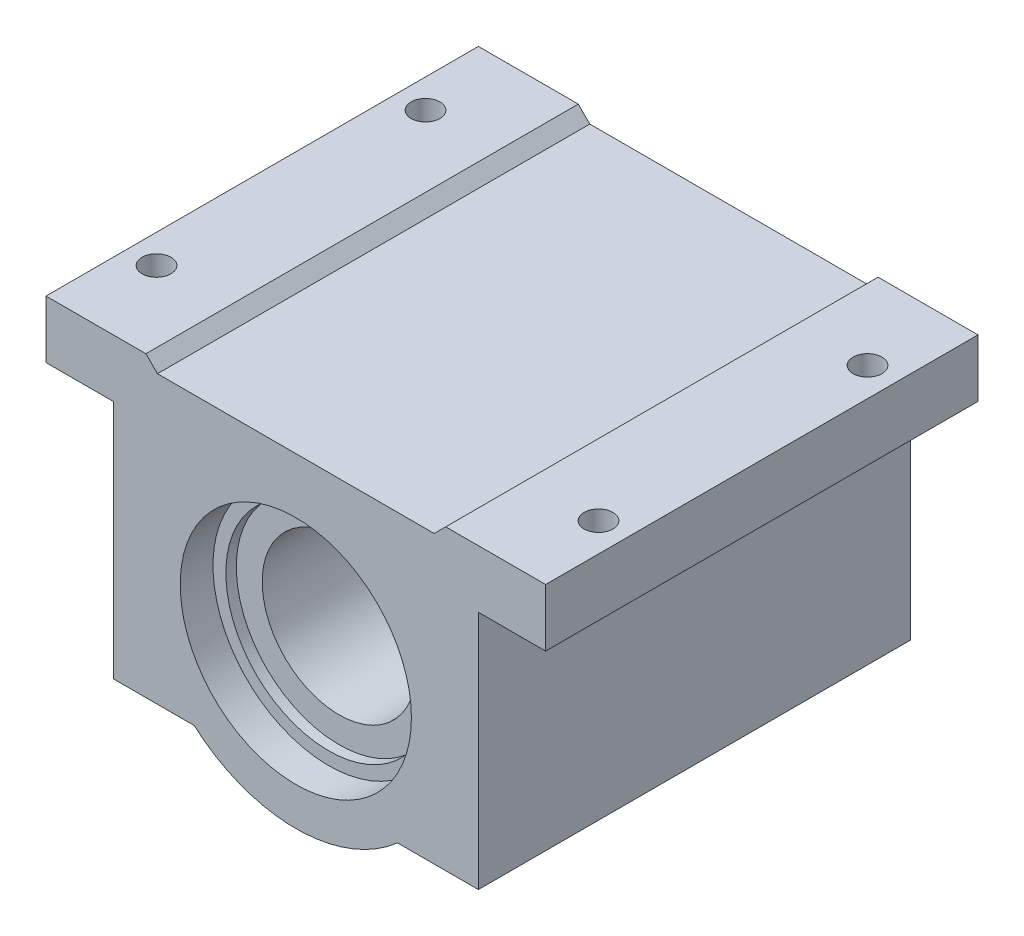
ISO-10303-21;
HEADER;
FILE_DESCRIPTION(('STEP AP214'),'2;1');
FILE_NAME('part.step','',(''),(''),'','','');
FILE_SCHEMA(('AUTOMOTIVE_DESIGN { 1 0 10303 214 1 1 1 1 }'));
ENDSEC;
DATA;
#1=APPLICATION_CONTEXT('core data for automotive mechanical design processes');
#2=APPLICATION_PROTOCOL_DEFINITION('international standard','automotive_design',2000,#1);
#3=PRODUCT_CONTEXT('',#1,'mechanical');
#4=PRODUCT('Part','Part','',(#3));
#5=PRODUCT_RELATED_PRODUCT_CATEGORY('part','',(#4));
#6=PRODUCT_DEFINITION_FORMATION('','',#4);
#7=PRODUCT_DEFINITION_CONTEXT('part definition',#1,'design');
#8=PRODUCT_DEFINITION('design','',#6,#7);
#9=PRODUCT_DEFINITION_SHAPE('','',#8);
#10=(LENGTH_UNIT() NAMED_UNIT(*) SI_UNIT(.MILLI.,.METRE.));
#11=(NAMED_UNIT(*) PLANE_ANGLE_UNIT() SI_UNIT($,.RADIAN.));
#12=(NAMED_UNIT(*) SI_UNIT($,.STERADIAN.) SOLID_ANGLE_UNIT());
#13=UNCERTAINTY_MEASURE_WITH_UNIT(LENGTH_MEASURE(1.E-05),#10,'distance_accuracy_value','');
#14=(GEOMETRIC_REPRESENTATION_CONTEXT(3) GLOBAL_UNCERTAINTY_ASSIGNED_CONTEXT((#13)) GLOBAL_UNIT_ASSIGNED_CONTEXT((#10,
#11,#12)) REPRESENTATION_CONTEXT('',''));
#15=CARTESIAN_POINT('',(0.,0.,0.));
#16=DIRECTION('',(0.,0.,1.));
#17=DIRECTION('',(1.,0.,0.));
#18=AXIS2_PLACEMENT_3D('',#15,#16,#17);
#19=CARTESIAN_POINT('',(0.,0.,28.575));
#20=DIRECTION('',(0.,0.,1.));
#21=DIRECTION('',(1.,0.,0.));
#22=AXIS2_PLACEMENT_3D('',#19,#20,#21);
#23=CYLINDRICAL_SURFACE('',#22,21.2217);
#24=CARTESIAN_POINT('',(0.,0.,28.575));
#25=DIRECTION('',(0.,0.,1.));
#26=DIRECTION('',(1.,0.,0.));
#27=AXIS2_PLACEMENT_3D('',#24,#25,#26);
#28=CIRCLE('',#27,21.2217);
#29=CARTESIAN_POINT('',(21.2217,0.,28.575));
#30=VERTEX_POINT('',#29);
#31=EDGE_CURVE('E11',#30,#30,#28,.T.);
#32=ORIENTED_EDGE('',*,*,#31,.T.);
#33=EDGE_LOOP('',(#32));
#34=FACE_BOUND('',#33,.T.);
#35=CARTESIAN_POINT('',(0.,0.,30.3022));
#36=DIRECTION('',(0.,0.,1.));
#37=DIRECTION('',(1.,0.,0.));
#38=AXIS2_PLACEMENT_3D('',#35,#36,#37);
#39=CIRCLE('',#38,21.2217);
#40=CARTESIAN_POINT('',(21.2217,0.,30.3022));
#41=VERTEX_POINT('',#40);
#42=EDGE_CURVE('E55',#41,#41,#39,.T.);
#43=ORIENTED_EDGE('',*,*,#42,.F.);
#44=EDGE_LOOP('',(#43));
#45=FACE_BOUND('',#44,.T.);
#46=ADVANCED_FACE('F41',(#34,#45),#23,.T.);
#47=CARTESIAN_POINT('',(-1.18552271245644E-13,16.97736,28.575));
#48=DIRECTION('',(0.,0.,-1.));
#49=DIRECTION('',(-1.,0.,0.));
#50=AXIS2_PLACEMENT_3D('',#47,#48,#49);
#51=PLANE('',#50);
#52=CARTESIAN_POINT('',(0.,0.,28.575));
#53=DIRECTION('',(0.,0.,1.));
#54=DIRECTION('',(1.,0.,0.));
#55=AXIS2_PLACEMENT_3D('',#52,#53,#54);
#56=CIRCLE('',#55,16.97736);
#57=CARTESIAN_POINT('',(16.97736,0.,28.575));
#58=VERTEX_POINT('',#57);
#59=EDGE_CURVE('E47',#58,#58,#56,.T.);
#60=ORIENTED_EDGE('',*,*,#59,.T.);
#61=EDGE_LOOP('',(#60));
#62=FACE_BOUND('',#61,.T.);
#63=ORIENTED_EDGE('',*,*,#31,.F.);
#64=EDGE_LOOP('',(#63));
#65=FACE_BOUND('',#64,.T.);
#66=ADVANCED_FACE('F65',(#62,#65),#51,.T.);
#67=CARTESIAN_POINT('',(0.,0.,28.575));
#68=DIRECTION('',(0.,0.,1.));
#69=DIRECTION('',(1.,0.,0.));
#70=AXIS2_PLACEMENT_3D('',#67,#68,#69);
#71=CYLINDRICAL_SURFACE('',#70,16.97736);
#72=CARTESIAN_POINT('',(0.,0.,30.3022));
#73=DIRECTION('',(0.,0.,1.));
#74=DIRECTION('',(1.,0.,0.));
#75=AXIS2_PLACEMENT_3D('',#72,#73,#74);
#76=CIRCLE('',#75,16.97736);
#77=CARTESIAN_POINT('',(16.97736,0.,30.3022));
#78=VERTEX_POINT('',#77);
#79=EDGE_CURVE('E51',#78,#78,#76,.T.);
#80=ORIENTED_EDGE('',*,*,#79,.T.);
#81=EDGE_LOOP('',(#80));
#82=FACE_BOUND('',#81,.T.);
#83=ORIENTED_EDGE('',*,*,#59,.F.);
#84=EDGE_LOOP('',(#83));
#85=FACE_BOUND('',#84,.T.);
#86=ADVANCED_FACE('F69',(#82,#85),#71,.F.);
#87=CARTESIAN_POINT('',(-1.18552271245644E-13,16.97736,30.3022));
#88=DIRECTION('',(0.,0.,1.));
#89=DIRECTION('',(1.,0.,0.));
#90=AXIS2_PLACEMENT_3D('',#87,#88,#89);
#91=PLANE('',#90);
#92=ORIENTED_EDGE('',*,*,#42,.T.);
#93=EDGE_LOOP('',(#92));
#94=FACE_BOUND('',#93,.T.);
#95=ORIENTED_EDGE('',*,*,#79,.F.);
#96=EDGE_LOOP('',(#95));
#97=FACE_BOUND('',#96,.T.);
#98=ADVANCED_FACE('F61',(#94,#97),#91,.T.);
#99=CLOSED_SHELL('',(#46,#66,#86,#98));
#100=MANIFOLD_SOLID_BREP('B2',#99);
#101=CARTESIAN_POINT('',(0.,0.,28.575));
#102=DIRECTION('',(0.,0.,1.));
#103=DIRECTION('',(1.,0.,0.));
#104=AXIS2_PLACEMENT_3D('',#101,#102,#103);
#105=CYLINDRICAL_SURFACE('',#104,21.2217);
#106=CARTESIAN_POINT('',(0.,0.,-30.3022));
#107=DIRECTION('',(0.,0.,1.));
#108=DIRECTION('',(1.,0.,0.));
#109=AXIS2_PLACEMENT_3D('',#106,#107,#108);
#110=CIRCLE('',#109,21.2217);
#111=CARTESIAN_POINT('',(21.2217,0.,-30.3022));
#112=VERTEX_POINT('',#111);
#113=EDGE_CURVE('E124',#112,#112,#110,.T.);
#114=ORIENTED_EDGE('',*,*,#113,.T.);
#115=EDGE_LOOP('',(#114));
#116=FACE_BOUND('',#115,.T.);
#117=CARTESIAN_POINT('',(0.,0.,-28.575));
#118=DIRECTION('',(0.,0.,1.));
#119=DIRECTION('',(1.,0.,0.));
#120=AXIS2_PLACEMENT_3D('',#117,#118,#119);
#121=CIRCLE('',#120,21.2217);
#122=CARTESIAN_POINT('',(21.2217,0.,-28.575));
#123=VERTEX_POINT('',#122);
#124=EDGE_CURVE('E40',#123,#123,#121,.T.);
#125=ORIENTED_EDGE('',*,*,#124,.F.);
#126=EDGE_LOOP('',(#125));
#127=FACE_BOUND('',#126,.T.);
#128=ADVANCED_FACE('F110',(#116,#127),#105,.T.);
#129=CARTESIAN_POINT('',(-1.18552271245644E-13,16.97736,-28.575));
#130=DIRECTION('',(0.,0.,1.));
#131=DIRECTION('',(1.,0.,0.));
#132=AXIS2_PLACEMENT_3D('',#129,#130,#131);
#133=PLANE('',#132);
#134=ORIENTED_EDGE('',*,*,#124,.T.);
#135=EDGE_LOOP('',(#134));
#136=FACE_BOUND('',#135,.T.);
#137=CARTESIAN_POINT('',(0.,0.,-28.575));
#138=DIRECTION('',(0.,0.,1.));
#139=DIRECTION('',(1.,0.,0.));
#140=AXIS2_PLACEMENT_3D('',#137,#138,#139);
#141=CIRCLE('',#140,16.97736);
#142=CARTESIAN_POINT('',(16.97736,0.,-28.575));
#143=VERTEX_POINT('',#142);
#144=EDGE_CURVE('E116',#143,#143,#141,.T.);
#145=ORIENTED_EDGE('',*,*,#144,.F.);
#146=EDGE_LOOP('',(#145));
#147=FACE_BOUND('',#146,.T.);
#148=ADVANCED_FACE('F140',(#136,#147),#133,.T.);
#149=CARTESIAN_POINT('',(0.,0.,28.575));
#150=DIRECTION('',(0.,0.,1.));
#151=DIRECTION('',(1.,0.,0.));
#152=AXIS2_PLACEMENT_3D('',#149,#150,#151);
#153=CYLINDRICAL_SURFACE('',#152,16.97736);
#154=ORIENTED_EDGE('',*,*,#144,.T.);
#155=EDGE_LOOP('',(#154));
#156=FACE_BOUND('',#155,.T.);
#157=CARTESIAN_POINT('',(0.,0.,-30.3022));
#158=DIRECTION('',(0.,0.,1.));
#159=DIRECTION('',(1.,0.,0.));
#160=AXIS2_PLACEMENT_3D('',#157,#158,#159);
#161=CIRCLE('',#160,16.97736);
#162=CARTESIAN_POINT('',(16.97736,0.,-30.3022));
#163=VERTEX_POINT('',#162);
#164=EDGE_CURVE('E120',#163,#163,#161,.T.);
#165=ORIENTED_EDGE('',*,*,#164,.F.);
#166=EDGE_LOOP('',(#165));
#167=FACE_BOUND('',#166,.T.);
#168=ADVANCED_FACE('F134',(#156,#167),#153,.F.);
#169=CARTESIAN_POINT('',(-1.18552271245644E-13,16.97736,-30.3022));
#170=DIRECTION('',(0.,0.,-1.));
#171=DIRECTION('',(-1.,0.,0.));
#172=AXIS2_PLACEMENT_3D('',#169,#170,#171);
#173=PLANE('',#172);
#174=ORIENTED_EDGE('',*,*,#164,.T.);
#175=EDGE_LOOP('',(#174));
#176=FACE_BOUND('',#175,.T.);
#177=ORIENTED_EDGE('',*,*,#113,.F.);
#178=EDGE_LOOP('',(#177));
#179=FACE_BOUND('',#178,.T.);
#180=ADVANCED_FACE('F132',(#176,#179),#173,.T.);
#181=CLOSED_SHELL('',(#128,#148,#168,#180));
#182=MANIFOLD_SOLID_BREP('B6',#181);
#183=CARTESIAN_POINT('',(0.,0.,28.575));
#184=DIRECTION('',(0.,0.,1.));
#185=DIRECTION('',(1.,0.,0.));
#186=AXIS2_PLACEMENT_3D('',#183,#184,#185);
#187=PLANE('',#186);
#188=CARTESIAN_POINT('',(0.,0.,28.575));
#189=DIRECTION('',(0.,0.,1.));
#190=DIRECTION('',(1.,0.,0.));
#191=AXIS2_PLACEMENT_3D('',#188,#189,#190);
#192=CIRCLE('',#191,19.09953);
#193=CARTESIAN_POINT('',(19.09953,0.,28.575));
#194=VERTEX_POINT('',#193);
#195=EDGE_CURVE('E109',#194,#194,#192,.T.);
#196=ORIENTED_EDGE('',*,*,#195,.T.);
#197=EDGE_LOOP('',(#196));
#198=FACE_BOUND('',#197,.T.);
#199=CARTESIAN_POINT('',(0.,0.,28.575));
#200=DIRECTION('',(0.,0.,1.));
#201=DIRECTION('',(1.,0.,0.));
#202=AXIS2_PLACEMENT_3D('',#199,#200,#201);
#203=CIRCLE('',#202,12.7);
#204=CARTESIAN_POINT('',(12.7,0.,28.575));
#205=VERTEX_POINT('',#204);
#206=EDGE_CURVE('E191',#205,#205,#203,.T.);
#207=ORIENTED_EDGE('',*,*,#206,.F.);
#208=EDGE_LOOP('',(#207));
#209=FACE_BOUND('',#208,.T.);
#210=ADVANCED_FACE('F180',(#198,#209),#187,.T.);
#211=CARTESIAN_POINT('',(0.,0.,-28.575));
#212=DIRECTION('',(0.,0.,1.));
#213=DIRECTION('',(1.,0.,0.));
#214=AXIS2_PLACEMENT_3D('',#211,#212,#213);
#215=PLANE('',#214);
#216=CARTESIAN_POINT('',(0.,0.,-28.575));
#217=DIRECTION('',(0.,0.,1.));
#218=DIRECTION('',(1.,0.,0.));
#219=AXIS2_PLACEMENT_3D('',#216,#217,#218);
#220=CIRCLE('',#219,19.09953);
#221=CARTESIAN_POINT('',(19.09953,0.,-28.575));
#222=VERTEX_POINT('',#221);
#223=EDGE_CURVE('E184',#222,#222,#220,.T.);
#224=ORIENTED_EDGE('',*,*,#223,.F.);
#225=EDGE_LOOP('',(#224));
#226=FACE_BOUND('',#225,.T.);
#227=CARTESIAN_POINT('',(0.,0.,-28.575));
#228=DIRECTION('',(0.,0.,1.));
#229=DIRECTION('',(1.,0.,0.));
#230=AXIS2_PLACEMENT_3D('',#227,#228,#229);
#231=CIRCLE('',#230,12.7);
#232=CARTESIAN_POINT('',(12.7,0.,-28.575));
#233=VERTEX_POINT('',#232);
#234=EDGE_CURVE('E193',#233,#233,#231,.T.);
#235=ORIENTED_EDGE('',*,*,#234,.T.);
#236=EDGE_LOOP('',(#235));
#237=FACE_BOUND('',#236,.T.);
#238=ADVANCED_FACE('F203',(#226,#237),#215,.F.);
#239=CARTESIAN_POINT('',(0.,0.,28.575));
#240=DIRECTION('',(0.,0.,-1.));
#241=DIRECTION('',(-1.,0.,0.));
#242=AXIS2_PLACEMENT_3D('',#239,#240,#241);
#243=CYLINDRICAL_SURFACE('',#242,19.09953);
#244=ORIENTED_EDGE('',*,*,#195,.F.);
#245=EDGE_LOOP('',(#244));
#246=FACE_BOUND('',#245,.T.);
#247=ORIENTED_EDGE('',*,*,#223,.T.);
#248=EDGE_LOOP('',(#247));
#249=FACE_BOUND('',#248,.T.);
#250=ADVANCED_FACE('F182',(#246,#249),#243,.T.);
#251=CARTESIAN_POINT('',(0.,0.,28.575));
#252=DIRECTION('',(0.,0.,-1.));
#253=DIRECTION('',(-1.,0.,0.));
#254=AXIS2_PLACEMENT_3D('',#251,#252,#253);
#255=CYLINDRICAL_SURFACE('',#254,12.7);
#256=ORIENTED_EDGE('',*,*,#206,.T.);
#257=EDGE_LOOP('',(#256));
#258=FACE_BOUND('',#257,.T.);
#259=ORIENTED_EDGE('',*,*,#234,.F.);
#260=EDGE_LOOP('',(#259));
#261=FACE_BOUND('',#260,.T.);
#262=ADVANCED_FACE('F199',(#258,#261),#255,.F.);
#263=CLOSED_SHELL('',(#210,#238,#250,#262));
#264=MANIFOLD_SOLID_BREP('B35',#263);
#265=CARTESIAN_POINT('',(0.,0.,35.71875));
#266=DIRECTION('',(0.,0.,-1.));
#267=DIRECTION('',(-1.,0.,0.));
#268=AXIS2_PLACEMENT_3D('',#265,#266,#267);
#269=CYLINDRICAL_SURFACE('',#268,19.09953);
#270=CARTESIAN_POINT('',(0.,0.,28.575));
#271=DIRECTION('',(0.,0.,-1.));
#272=DIRECTION('',(-1.,0.,0.));
#273=AXIS2_PLACEMENT_3D('',#270,#271,#272);
#274=CIRCLE('',#273,19.09953);
#275=CARTESIAN_POINT('',(-19.09953,0.,28.575));
#276=VERTEX_POINT('',#275);
#277=EDGE_CURVE('E245',#276,#276,#274,.T.);
#278=ORIENTED_EDGE('',*,*,#277,.F.);
#279=EDGE_LOOP('',(#278));
#280=FACE_BOUND('',#279,.T.);
#281=CARTESIAN_POINT('',(0.,0.,-28.575));
#282=DIRECTION('',(0.,0.,1.));
#283=DIRECTION('',(1.,0.,0.));
#284=AXIS2_PLACEMENT_3D('',#281,#282,#283);
#285=CIRCLE('',#284,19.09953);
#286=CARTESIAN_POINT('',(19.09953,0.,-28.575));
#287=VERTEX_POINT('',#286);
#288=EDGE_CURVE('E437',#287,#287,#285,.T.);
#289=ORIENTED_EDGE('',*,*,#288,.F.);
#290=EDGE_LOOP('',(#289));
#291=FACE_BOUND('',#290,.T.);
#292=ADVANCED_FACE('F241',(#280,#291),#269,.F.);
#293=CARTESIAN_POINT('',(0.,0.,30.3022));
#294=DIRECTION('',(0.,0.,1.));
#295=DIRECTION('',(1.,0.,0.));
#296=AXIS2_PLACEMENT_3D('',#293,#294,#295);
#297=CIRCLE('',#296,19.09953);
#298=CARTESIAN_POINT('',(19.09953,0.,30.3022));
#299=VERTEX_POINT('',#298);
#300=EDGE_CURVE('E441',#299,#299,#297,.T.);
#301=ORIENTED_EDGE('',*,*,#300,.F.);
#302=EDGE_LOOP('',(#301));
#303=FACE_BOUND('',#302,.T.);
#304=CARTESIAN_POINT('',(0.,0.,35.71875));
#305=DIRECTION('',(0.,0.,1.));
#306=DIRECTION('',(1.,0.,0.));
#307=AXIS2_PLACEMENT_3D('',#304,#305,#306);
#308=CIRCLE('',#307,19.09953);
#309=CARTESIAN_POINT('',(19.09953,0.,35.71875));
#310=VERTEX_POINT('',#309);
#311=EDGE_CURVE('E381',#310,#310,#308,.T.);
#312=ORIENTED_EDGE('',*,*,#311,.T.);
#313=EDGE_LOOP('',(#312));
#314=FACE_BOUND('',#313,.T.);
#315=ADVANCED_FACE('F534',(#303,#314),#269,.F.);
#316=CARTESIAN_POINT('',(0.,0.,35.71875));
#317=DIRECTION('',(0.,0.,1.));
#318=DIRECTION('',(1.,0.,0.));
#319=AXIS2_PLACEMENT_3D('',#316,#317,#318);
#320=PLANE('',#319);
#321=DIRECTION('',(0.,1.,0.));
#322=VECTOR('',#321,1.);
#323=CARTESIAN_POINT('',(30.1625,-19.05,35.71875));
#324=LINE('',#323,#322);
#325=CARTESIAN_POINT('',(30.1625,-19.05,35.71875));
#326=VERTEX_POINT('',#325);
#327=CARTESIAN_POINT('',(30.1625,20.6375,35.71875));
#328=VERTEX_POINT('',#327);
#329=EDGE_CURVE('E404',#326,#328,#324,.T.);
#330=ORIENTED_EDGE('',*,*,#329,.T.);
#331=DIRECTION('',(1.,0.,0.));
#332=VECTOR('',#331,1.);
#333=CARTESIAN_POINT('',(30.1625,20.6375,35.71875));
#334=LINE('',#333,#332);
#335=CARTESIAN_POINT('',(41.275,20.6375,35.71875));
#336=VERTEX_POINT('',#335);
#337=EDGE_CURVE('E321',#328,#336,#334,.T.);
#338=ORIENTED_EDGE('',*,*,#337,.T.);
#339=DIRECTION('',(0.,1.,0.));
#340=VECTOR('',#339,1.);
#341=CARTESIAN_POINT('',(41.275,20.6375,35.71875));
#342=LINE('',#341,#340);
#343=CARTESIAN_POINT('',(41.275,30.1625,35.71875));
#344=VERTEX_POINT('',#343);
#345=EDGE_CURVE('E490',#336,#344,#342,.T.);
#346=ORIENTED_EDGE('',*,*,#345,.T.);
#347=DIRECTION('',(-1.,0.,0.));
#348=VECTOR('',#347,1.);
#349=CARTESIAN_POINT('',(24.765,30.1625,35.71875));
#350=LINE('',#349,#348);
#351=CARTESIAN_POINT('',(24.765,30.1625,35.71875));
#352=VERTEX_POINT('',#351);
#353=EDGE_CURVE('E492',#344,#352,#350,.T.);
#354=ORIENTED_EDGE('',*,*,#353,.T.);
#355=DIRECTION('',(-0.707106781186546,-0.707106781186549,0.));
#356=VECTOR('',#355,1.);
#357=CARTESIAN_POINT('',(22.86,28.2575,35.71875));
#358=LINE('',#357,#356);
#359=CARTESIAN_POINT('',(22.86,28.2575,35.71875));
#360=VERTEX_POINT('',#359);
#361=EDGE_CURVE('E494',#352,#360,#358,.T.);
#362=ORIENTED_EDGE('',*,*,#361,.T.);
#363=DIRECTION('',(-1.,0.,0.));
#364=VECTOR('',#363,1.);
#365=CARTESIAN_POINT('',(-22.86,28.2575,35.71875));
#366=LINE('',#365,#364);
#367=CARTESIAN_POINT('',(-22.86,28.2575,35.71875));
#368=VERTEX_POINT('',#367);
#369=EDGE_CURVE('E496',#360,#368,#366,.T.);
#370=ORIENTED_EDGE('',*,*,#369,.T.);
#371=DIRECTION('',(-0.707106781186544,0.707106781186551,0.));
#372=VECTOR('',#371,1.);
#373=CARTESIAN_POINT('',(-24.765,30.1625,35.71875));
#374=LINE('',#373,#372);
#375=CARTESIAN_POINT('',(-24.765,30.1625,35.71875));
#376=VERTEX_POINT('',#375);
#377=EDGE_CURVE('E498',#368,#376,#374,.T.);
#378=ORIENTED_EDGE('',*,*,#377,.T.);
#379=DIRECTION('',(-1.,0.,0.));
#380=VECTOR('',#379,1.);
#381=CARTESIAN_POINT('',(-24.765,30.1625,35.71875));
#382=LINE('',#381,#380);
#383=CARTESIAN_POINT('',(-41.275,30.1625,35.71875));
#384=VERTEX_POINT('',#383);
#385=EDGE_CURVE('E500',#376,#384,#382,.T.);
#386=ORIENTED_EDGE('',*,*,#385,.T.);
#387=DIRECTION('',(0.,-1.,0.));
#388=VECTOR('',#387,1.);
#389=CARTESIAN_POINT('',(-41.275,20.6375,35.71875));
#390=LINE('',#389,#388);
#391=CARTESIAN_POINT('',(-41.275,20.6375,35.71875));
#392=VERTEX_POINT('',#391);
#393=EDGE_CURVE('E502',#384,#392,#390,.T.);
#394=ORIENTED_EDGE('',*,*,#393,.T.);
#395=DIRECTION('',(1.,0.,0.));
#396=VECTOR('',#395,1.);
#397=CARTESIAN_POINT('',(-30.1625,20.6375,35.71875));
#398=LINE('',#397,#396);
#399=CARTESIAN_POINT('',(-30.1625,20.6375,35.71875));
#400=VERTEX_POINT('',#399);
#401=EDGE_CURVE('E504',#392,#400,#398,.T.);
#402=ORIENTED_EDGE('',*,*,#401,.T.);
#403=DIRECTION('',(0.,-1.,0.));
#404=VECTOR('',#403,1.);
#405=CARTESIAN_POINT('',(-30.1625,20.6375,35.71875));
#406=LINE('',#405,#404);
#407=CARTESIAN_POINT('',(-30.1625,-19.05,35.71875));
#408=VERTEX_POINT('',#407);
#409=EDGE_CURVE('E359',#400,#408,#406,.T.);
#410=ORIENTED_EDGE('',*,*,#409,.T.);
#411=DIRECTION('',(1.,0.,0.));
#412=VECTOR('',#411,1.);
#413=CARTESIAN_POINT('',(-30.1625,-19.05,35.71875));
#414=LINE('',#413,#412);
#415=CARTESIAN_POINT('',(-16.8005208252602,-19.05,35.71875));
#416=VERTEX_POINT('',#415);
#417=EDGE_CURVE('E352',#408,#416,#414,.T.);
#418=ORIENTED_EDGE('',*,*,#417,.T.);
#419=CARTESIAN_POINT('',(0.,0.,35.71875));
#420=DIRECTION('',(0.,0.,1.));
#421=DIRECTION('',(1.,0.,0.));
#422=AXIS2_PLACEMENT_3D('',#419,#420,#421);
#423=CIRCLE('',#422,25.4);
#424=CARTESIAN_POINT('',(16.8005208252602,-19.05,35.71875));
#425=VERTEX_POINT('',#424);
#426=EDGE_CURVE('E357',#416,#425,#423,.T.);
#427=ORIENTED_EDGE('',*,*,#426,.T.);
#428=DIRECTION('',(1.,0.,0.));
#429=VECTOR('',#428,1.);
#430=CARTESIAN_POINT('',(16.8005208252602,-19.05,35.71875));
#431=LINE('',#430,#429);
#432=EDGE_CURVE('E260',#425,#326,#431,.T.);
#433=ORIENTED_EDGE('',*,*,#432,.T.);
#434=EDGE_LOOP('',(#330,#338,#346,#354,#362,#370,#378,#386,#394,#402,#410,#418,#427,#433));
#435=FACE_BOUND('',#434,.T.);
#436=ORIENTED_EDGE('',*,*,#311,.F.);
#437=EDGE_LOOP('',(#436));
#438=FACE_BOUND('',#437,.T.);
#439=ADVANCED_FACE('F354',(#435,#438),#320,.T.);
#440=CARTESIAN_POINT('',(0.,0.,-35.71875));
#441=DIRECTION('',(0.,0.,1.));
#442=DIRECTION('',(1.,0.,0.));
#443=AXIS2_PLACEMENT_3D('',#440,#441,#442);
#444=PLANE('',#443);
#445=DIRECTION('',(0.,1.,0.));
#446=VECTOR('',#445,1.);
#447=CARTESIAN_POINT('',(30.1625,-19.05,-35.71875));
#448=LINE('',#447,#446);
#449=CARTESIAN_POINT('',(30.1625,-19.05,-35.71875));
#450=VERTEX_POINT('',#449);
#451=CARTESIAN_POINT('',(30.1625,20.6375,-35.71875));
#452=VERTEX_POINT('',#451);
#453=EDGE_CURVE('E377',#450,#452,#448,.T.);
#454=ORIENTED_EDGE('',*,*,#453,.F.);
#455=DIRECTION('',(1.,0.,0.));
#456=VECTOR('',#455,1.);
#457=CARTESIAN_POINT('',(16.8005208252602,-19.05,-35.71875));
#458=LINE('',#457,#456);
#459=CARTESIAN_POINT('',(16.8005208252602,-19.05,-35.71875));
#460=VERTEX_POINT('',#459);
#461=EDGE_CURVE('E313',#460,#450,#458,.T.);
#462=ORIENTED_EDGE('',*,*,#461,.F.);
#463=CARTESIAN_POINT('',(0.,0.,-35.71875));
#464=DIRECTION('',(0.,0.,1.));
#465=DIRECTION('',(1.,0.,0.));
#466=AXIS2_PLACEMENT_3D('',#463,#464,#465);
#467=CIRCLE('',#466,25.4);
#468=CARTESIAN_POINT('',(-16.8005208252602,-19.05,-35.71875));
#469=VERTEX_POINT('',#468);
#470=EDGE_CURVE('E307',#469,#460,#467,.T.);
#471=ORIENTED_EDGE('',*,*,#470,.F.);
#472=DIRECTION('',(1.,0.,0.));
#473=VECTOR('',#472,1.);
#474=CARTESIAN_POINT('',(-30.1625,-19.05,-35.71875));
#475=LINE('',#474,#473);
#476=CARTESIAN_POINT('',(-30.1625,-19.05,-35.71875));
#477=VERTEX_POINT('',#476);
#478=EDGE_CURVE('E367',#477,#469,#475,.T.);
#479=ORIENTED_EDGE('',*,*,#478,.F.);
#480=DIRECTION('',(0.,-1.,0.));
#481=VECTOR('',#480,1.);
#482=CARTESIAN_POINT('',(-30.1625,20.6375,-35.71875));
#483=LINE('',#482,#481);
#484=CARTESIAN_POINT('',(-30.1625,20.6375,-35.71875));
#485=VERTEX_POINT('',#484);
#486=EDGE_CURVE('E399',#485,#477,#483,.T.);
#487=ORIENTED_EDGE('',*,*,#486,.F.);
#488=DIRECTION('',(1.,0.,0.));
#489=VECTOR('',#488,1.);
#490=CARTESIAN_POINT('',(-30.1625,20.6375,-35.71875));
#491=LINE('',#490,#489);
#492=CARTESIAN_POINT('',(-41.275,20.6375,-35.71875));
#493=VERTEX_POINT('',#492);
#494=EDGE_CURVE('E397',#493,#485,#491,.T.);
#495=ORIENTED_EDGE('',*,*,#494,.F.);
#496=DIRECTION('',(0.,-1.,0.));
#497=VECTOR('',#496,1.);
#498=CARTESIAN_POINT('',(-41.275,20.6375,-35.71875));
#499=LINE('',#498,#497);
#500=CARTESIAN_POINT('',(-41.275,30.1625,-35.71875));
#501=VERTEX_POINT('',#500);
#502=EDGE_CURVE('E395',#501,#493,#499,.T.);
#503=ORIENTED_EDGE('',*,*,#502,.F.);
#504=DIRECTION('',(-1.,0.,0.));
#505=VECTOR('',#504,1.);
#506=CARTESIAN_POINT('',(-24.765,30.1625,-35.71875));
#507=LINE('',#506,#505);
#508=CARTESIAN_POINT('',(-24.765,30.1625,-35.71875));
#509=VERTEX_POINT('',#508);
#510=EDGE_CURVE('E393',#509,#501,#507,.T.);
#511=ORIENTED_EDGE('',*,*,#510,.F.);
#512=DIRECTION('',(-0.707106781186544,0.707106781186551,0.));
#513=VECTOR('',#512,1.);
#514=CARTESIAN_POINT('',(-24.765,30.1625,-35.71875));
#515=LINE('',#514,#513);
#516=CARTESIAN_POINT('',(-22.86,28.2575,-35.71875));
#517=VERTEX_POINT('',#516);
#518=EDGE_CURVE('E391',#517,#509,#515,.T.);
#519=ORIENTED_EDGE('',*,*,#518,.F.);
#520=DIRECTION('',(-1.,0.,0.));
#521=VECTOR('',#520,1.);
#522=CARTESIAN_POINT('',(-22.86,28.2575,-35.71875));
#523=LINE('',#522,#521);
#524=CARTESIAN_POINT('',(22.86,28.2575,-35.71875));
#525=VERTEX_POINT('',#524);
#526=EDGE_CURVE('E389',#525,#517,#523,.T.);
#527=ORIENTED_EDGE('',*,*,#526,.F.);
#528=DIRECTION('',(-0.707106781186546,-0.707106781186549,0.));
#529=VECTOR('',#528,1.);
#530=CARTESIAN_POINT('',(22.86,28.2575,-35.71875));
#531=LINE('',#530,#529);
#532=CARTESIAN_POINT('',(24.765,30.1625,-35.71875));
#533=VERTEX_POINT('',#532);
#534=EDGE_CURVE('E387',#533,#525,#531,.T.);
#535=ORIENTED_EDGE('',*,*,#534,.F.);
#536=DIRECTION('',(-1.,0.,0.));
#537=VECTOR('',#536,1.);
#538=CARTESIAN_POINT('',(24.765,30.1625,-35.71875));
#539=LINE('',#538,#537);
#540=CARTESIAN_POINT('',(41.275,30.1625,-35.71875));
#541=VERTEX_POINT('',#540);
#542=EDGE_CURVE('E385',#541,#533,#539,.T.);
#543=ORIENTED_EDGE('',*,*,#542,.F.);
#544=DIRECTION('',(0.,1.,0.));
#545=VECTOR('',#544,1.);
#546=CARTESIAN_POINT('',(41.275,20.6375,-35.71875));
#547=LINE('',#546,#545);
#548=CARTESIAN_POINT('',(41.275,20.6375,-35.71875));
#549=VERTEX_POINT('',#548);
#550=EDGE_CURVE('E383',#549,#541,#547,.T.);
#551=ORIENTED_EDGE('',*,*,#550,.F.);
#552=DIRECTION('',(1.,0.,0.));
#553=VECTOR('',#552,1.);
#554=CARTESIAN_POINT('',(30.1625,20.6375,-35.71875));
#555=LINE('',#554,#553);
#556=EDGE_CURVE('E380',#452,#549,#555,.T.);
#557=ORIENTED_EDGE('',*,*,#556,.F.);
#558=EDGE_LOOP('',(#454,#462,#471,#479,#487,#495,#503,#511,#519,#527,#535,#543,#551,#557));
#559=FACE_BOUND('',#558,.T.);
#560=CARTESIAN_POINT('',(0.,0.,-35.71875));
#561=DIRECTION('',(0.,0.,1.));
#562=DIRECTION('',(1.,0.,0.));
#563=AXIS2_PLACEMENT_3D('',#560,#561,#562);
#564=CIRCLE('',#563,19.09953);
#565=CARTESIAN_POINT('',(19.09953,0.,-35.71875));
#566=VERTEX_POINT('',#565);
#567=EDGE_CURVE('E483',#566,#566,#564,.T.);
#568=ORIENTED_EDGE('',*,*,#567,.T.);
#569=EDGE_LOOP('',(#568));
#570=FACE_BOUND('',#569,.T.);
#571=ADVANCED_FACE('F517',(#559,#570),#444,.F.);
#572=CARTESIAN_POINT('',(30.1625,-19.05,35.71875));
#573=DIRECTION('',(-1.,0.,0.));
#574=DIRECTION('',(0.,-1.,0.));
#575=AXIS2_PLACEMENT_3D('',#572,#573,#574);
#576=PLANE('',#575);
#577=ORIENTED_EDGE('',*,*,#453,.T.);
#578=DIRECTION('',(0.,0.,-1.));
#579=VECTOR('',#578,1.);
#580=CARTESIAN_POINT('',(30.1625,20.6375,35.71875));
#581=LINE('',#580,#579);
#582=EDGE_CURVE('E178',#328,#452,#581,.T.);
#583=ORIENTED_EDGE('',*,*,#582,.F.);
#584=ORIENTED_EDGE('',*,*,#329,.F.);
#585=DIRECTION('',(0.,0.,-1.));
#586=VECTOR('',#585,1.);
#587=CARTESIAN_POINT('',(30.1625,-19.05,35.71875));
#588=LINE('',#587,#586);
#589=EDGE_CURVE('E373',#326,#450,#588,.T.);
#590=ORIENTED_EDGE('',*,*,#589,.T.);
#591=EDGE_LOOP('',(#577,#583,#584,#590));
#592=FACE_BOUND('',#591,.T.);
#593=ADVANCED_FACE('F243',(#592),#576,.F.);
#594=CARTESIAN_POINT('',(30.1625,20.6375,35.71875));
#595=DIRECTION('',(0.,1.,0.));
#596=DIRECTION('',(0.,0.,1.));
#597=AXIS2_PLACEMENT_3D('',#594,#595,#596);
#598=PLANE('',#597);
#599=CARTESIAN_POINT('',(36.5125,20.6375,22.225));
#600=DIRECTION('',(0.,1.,0.));
#601=DIRECTION('',(0.,0.,1.));
#602=AXIS2_PLACEMENT_3D('',#599,#600,#601);
#603=CIRCLE('',#602,2.38125);
#604=CARTESIAN_POINT('',(36.5125,20.6375,24.60625));
#605=VERTEX_POINT('',#604);
#606=EDGE_CURVE('E468',#605,#605,#603,.F.);
#607=ORIENTED_EDGE('',*,*,#606,.F.);
#608=EDGE_LOOP('',(#607));
#609=FACE_BOUND('',#608,.T.);
#610=CARTESIAN_POINT('',(36.5125,20.6375,-22.225));
#611=DIRECTION('',(0.,1.,0.));
#612=DIRECTION('',(0.,0.,1.));
#613=AXIS2_PLACEMENT_3D('',#610,#611,#612);
#614=CIRCLE('',#613,2.38125);
#615=CARTESIAN_POINT('',(36.5125,20.6375,-19.84375));
#616=VERTEX_POINT('',#615);
#617=EDGE_CURVE('E474',#616,#616,#614,.F.);
#618=ORIENTED_EDGE('',*,*,#617,.F.);
#619=EDGE_LOOP('',(#618));
#620=FACE_BOUND('',#619,.T.);
#621=ORIENTED_EDGE('',*,*,#556,.T.);
#622=DIRECTION('',(0.,0.,-1.));
#623=VECTOR('',#622,1.);
#624=CARTESIAN_POINT('',(41.275,20.6375,35.71875));
#625=LINE('',#624,#623);
#626=EDGE_CURVE('E251',#336,#549,#625,.T.);
#627=ORIENTED_EDGE('',*,*,#626,.F.);
#628=ORIENTED_EDGE('',*,*,#337,.F.);
#629=ORIENTED_EDGE('',*,*,#582,.T.);
#630=EDGE_LOOP('',(#621,#627,#628,#629));
#631=FACE_BOUND('',#630,.T.);
#632=ADVANCED_FACE('F553',(#609,#620,#631),#598,.F.);
#633=CARTESIAN_POINT('',(41.275,20.6375,35.71875));
#634=DIRECTION('',(-1.,0.,0.));
#635=DIRECTION('',(0.,-1.,0.));
#636=AXIS2_PLACEMENT_3D('',#633,#634,#635);
#637=PLANE('',#636);
#638=ORIENTED_EDGE('',*,*,#550,.T.);
#639=DIRECTION('',(0.,0.,-1.));
#640=VECTOR('',#639,1.);
#641=CARTESIAN_POINT('',(41.275,30.1625,35.71875));
#642=LINE('',#641,#640);
#643=EDGE_CURVE('E429',#344,#541,#642,.T.);
#644=ORIENTED_EDGE('',*,*,#643,.F.);
#645=ORIENTED_EDGE('',*,*,#345,.F.);
#646=ORIENTED_EDGE('',*,*,#626,.T.);
#647=EDGE_LOOP('',(#638,#644,#645,#646));
#648=FACE_BOUND('',#647,.T.);
#649=ADVANCED_FACE('F557',(#648),#637,.F.);
#650=CARTESIAN_POINT('',(24.765,30.1625,35.71875));
#651=DIRECTION('',(0.,-1.,0.));
#652=DIRECTION('',(1.,0.,0.));
#653=AXIS2_PLACEMENT_3D('',#650,#651,#652);
#654=PLANE('',#653);
#655=CARTESIAN_POINT('',(36.5125,30.1625,22.225));
#656=DIRECTION('',(0.,1.,0.));
#657=DIRECTION('',(0.,0.,1.));
#658=AXIS2_PLACEMENT_3D('',#655,#656,#657);
#659=CIRCLE('',#658,2.38125);
#660=CARTESIAN_POINT('',(36.5125,30.1625,24.60625));
#661=VERTEX_POINT('',#660);
#662=EDGE_CURVE('E465',#661,#661,#659,.T.);
#663=ORIENTED_EDGE('',*,*,#662,.F.);
#664=EDGE_LOOP('',(#663));
#665=FACE_BOUND('',#664,.T.);
#666=CARTESIAN_POINT('',(36.5125,30.1625,-22.225));
#667=DIRECTION('',(0.,1.,0.));
#668=DIRECTION('',(0.,0.,1.));
#669=AXIS2_PLACEMENT_3D('',#666,#667,#668);
#670=CIRCLE('',#669,2.38125);
#671=CARTESIAN_POINT('',(36.5125,30.1625,-19.84375));
#672=VERTEX_POINT('',#671);
#673=EDGE_CURVE('E471',#672,#672,#670,.T.);
#674=ORIENTED_EDGE('',*,*,#673,.F.);
#675=EDGE_LOOP('',(#674));
#676=FACE_BOUND('',#675,.T.);
#677=ORIENTED_EDGE('',*,*,#542,.T.);
#678=DIRECTION('',(0.,0.,-1.));
#679=VECTOR('',#678,1.);
#680=CARTESIAN_POINT('',(24.765,30.1625,35.71875));
#681=LINE('',#680,#679);
#682=EDGE_CURVE('E426',#352,#533,#681,.T.);
#683=ORIENTED_EDGE('',*,*,#682,.F.);
#684=ORIENTED_EDGE('',*,*,#353,.F.);
#685=ORIENTED_EDGE('',*,*,#643,.T.);
#686=EDGE_LOOP('',(#677,#683,#684,#685));
#687=FACE_BOUND('',#686,.T.);
#688=ADVANCED_FACE('F562',(#665,#676,#687),#654,.F.);
#689=CARTESIAN_POINT('',(22.86,28.2575,35.71875));
#690=DIRECTION('',(0.707106781186549,-0.707106781186546,0.));
#691=DIRECTION('',(0.707106781186546,0.707106781186549,0.));
#692=AXIS2_PLACEMENT_3D('',#689,#690,#691);
#693=PLANE('',#692);
#694=ORIENTED_EDGE('',*,*,#534,.T.);
#695=DIRECTION('',(0.,0.,-1.));
#696=VECTOR('',#695,1.);
#697=CARTESIAN_POINT('',(22.86,28.2575,35.71875));
#698=LINE('',#697,#696);
#699=EDGE_CURVE('E423',#360,#525,#698,.T.);
#700=ORIENTED_EDGE('',*,*,#699,.F.);
#701=ORIENTED_EDGE('',*,*,#361,.F.);
#702=ORIENTED_EDGE('',*,*,#682,.T.);
#703=EDGE_LOOP('',(#694,#700,#701,#702));
#704=FACE_BOUND('',#703,.T.);
#705=ADVANCED_FACE('F570',(#704),#693,.F.);
#706=CARTESIAN_POINT('',(-22.86,28.2575,35.71875));
#707=DIRECTION('',(0.,-1.,0.));
#708=DIRECTION('',(0.,0.,-1.));
#709=AXIS2_PLACEMENT_3D('',#706,#707,#708);
#710=PLANE('',#709);
#711=ORIENTED_EDGE('',*,*,#526,.T.);
#712=DIRECTION('',(0.,0.,-1.));
#713=VECTOR('',#712,1.);
#714=CARTESIAN_POINT('',(-22.86,28.2575,35.71875));
#715=LINE('',#714,#713);
#716=EDGE_CURVE('E420',#368,#517,#715,.T.);
#717=ORIENTED_EDGE('',*,*,#716,.F.);
#718=ORIENTED_EDGE('',*,*,#369,.F.);
#719=ORIENTED_EDGE('',*,*,#699,.T.);
#720=EDGE_LOOP('',(#711,#717,#718,#719));
#721=FACE_BOUND('',#720,.T.);
#722=ADVANCED_FACE('F574',(#721),#710,.F.);
#723=CARTESIAN_POINT('',(-24.765,30.1625,35.71875));
#724=DIRECTION('',(-0.707106781186551,-0.707106781186544,0.));
#725=DIRECTION('',(0.707106781186544,-0.707106781186551,0.));
#726=AXIS2_PLACEMENT_3D('',#723,#724,#725);
#727=PLANE('',#726);
#728=ORIENTED_EDGE('',*,*,#518,.T.);
#729=DIRECTION('',(0.,0.,-1.));
#730=VECTOR('',#729,1.);
#731=CARTESIAN_POINT('',(-24.765,30.1625,35.71875));
#732=LINE('',#731,#730);
#733=EDGE_CURVE('E417',#376,#509,#732,.T.);
#734=ORIENTED_EDGE('',*,*,#733,.F.);
#735=ORIENTED_EDGE('',*,*,#377,.F.);
#736=ORIENTED_EDGE('',*,*,#716,.T.);
#737=EDGE_LOOP('',(#728,#734,#735,#736));
#738=FACE_BOUND('',#737,.T.);
#739=ADVANCED_FACE('F578',(#738),#727,.F.);
#740=CARTESIAN_POINT('',(-24.765,30.1625,35.71875));
#741=DIRECTION('',(0.,-1.,0.));
#742=DIRECTION('',(1.,0.,0.));
#743=AXIS2_PLACEMENT_3D('',#740,#741,#742);
#744=PLANE('',#743);
#745=CARTESIAN_POINT('',(-36.5125,30.1625,22.225));
#746=DIRECTION('',(0.,1.,0.));
#747=DIRECTION('',(0.,0.,1.));
#748=AXIS2_PLACEMENT_3D('',#745,#746,#747);
#749=CIRCLE('',#748,2.38125);
#750=CARTESIAN_POINT('',(-36.5125,30.1625,24.60625));
#751=VERTEX_POINT('',#750);
#752=EDGE_CURVE('E440',#751,#751,#749,.T.);
#753=ORIENTED_EDGE('',*,*,#752,.F.);
#754=EDGE_LOOP('',(#753));
#755=FACE_BOUND('',#754,.T.);
#756=CARTESIAN_POINT('',(-36.5125,30.1625,-22.225));
#757=DIRECTION('',(0.,1.,0.));
#758=DIRECTION('',(0.,0.,1.));
#759=AXIS2_PLACEMENT_3D('',#756,#757,#758);
#760=CIRCLE('',#759,2.38125);
#761=CARTESIAN_POINT('',(-36.5125,30.1625,-19.84375));
#762=VERTEX_POINT('',#761);
#763=EDGE_CURVE('E477',#762,#762,#760,.T.);
#764=ORIENTED_EDGE('',*,*,#763,.F.);
#765=EDGE_LOOP('',(#764));
#766=FACE_BOUND('',#765,.T.);
#767=ORIENTED_EDGE('',*,*,#510,.T.);
#768=DIRECTION('',(0.,0.,-1.));
#769=VECTOR('',#768,1.);
#770=CARTESIAN_POINT('',(-41.275,30.1625,35.71875));
#771=LINE('',#770,#769);
#772=EDGE_CURVE('E414',#384,#501,#771,.T.);
#773=ORIENTED_EDGE('',*,*,#772,.F.);
#774=ORIENTED_EDGE('',*,*,#385,.F.);
#775=ORIENTED_EDGE('',*,*,#733,.T.);
#776=EDGE_LOOP('',(#767,#773,#774,#775));
#777=FACE_BOUND('',#776,.T.);
#778=ADVANCED_FACE('F582',(#755,#766,#777),#744,.F.);
#779=CARTESIAN_POINT('',(-41.275,20.6375,35.71875));
#780=DIRECTION('',(1.,0.,0.));
#781=DIRECTION('',(0.,0.,-1.));
#782=AXIS2_PLACEMENT_3D('',#779,#780,#781);
#783=PLANE('',#782);
#784=ORIENTED_EDGE('',*,*,#502,.T.);
#785=DIRECTION('',(0.,0.,-1.));
#786=VECTOR('',#785,1.);
#787=CARTESIAN_POINT('',(-41.275,20.6375,35.71875));
#788=LINE('',#787,#786);
#789=EDGE_CURVE('E411',#392,#493,#788,.T.);
#790=ORIENTED_EDGE('',*,*,#789,.F.);
#791=ORIENTED_EDGE('',*,*,#393,.F.);
#792=ORIENTED_EDGE('',*,*,#772,.T.);
#793=EDGE_LOOP('',(#784,#790,#791,#792));
#794=FACE_BOUND('',#793,.T.);
#795=ADVANCED_FACE('F586',(#794),#783,.F.);
#796=CARTESIAN_POINT('',(-30.1625,20.6375,35.71875));
#797=DIRECTION('',(0.,1.,0.));
#798=DIRECTION('',(-1.,0.,0.));
#799=AXIS2_PLACEMENT_3D('',#796,#797,#798);
#800=PLANE('',#799);
#801=CARTESIAN_POINT('',(-36.5125,20.6375,22.225));
#802=DIRECTION('',(0.,1.,0.));
#803=DIRECTION('',(0.,0.,1.));
#804=AXIS2_PLACEMENT_3D('',#801,#802,#803);
#805=CIRCLE('',#804,2.38125);
#806=CARTESIAN_POINT('',(-36.5125,20.6375,24.60625));
#807=VERTEX_POINT('',#806);
#808=EDGE_CURVE('E462',#807,#807,#805,.F.);
#809=ORIENTED_EDGE('',*,*,#808,.F.);
#810=EDGE_LOOP('',(#809));
#811=FACE_BOUND('',#810,.T.);
#812=CARTESIAN_POINT('',(-36.5125,20.6375,-22.225));
#813=DIRECTION('',(0.,1.,0.));
#814=DIRECTION('',(0.,0.,1.));
#815=AXIS2_PLACEMENT_3D('',#812,#813,#814);
#816=CIRCLE('',#815,2.38125);
#817=CARTESIAN_POINT('',(-36.5125,20.6375,-19.84375));
#818=VERTEX_POINT('',#817);
#819=EDGE_CURVE('E480',#818,#818,#816,.F.);
#820=ORIENTED_EDGE('',*,*,#819,.F.);
#821=EDGE_LOOP('',(#820));
#822=FACE_BOUND('',#821,.T.);
#823=ORIENTED_EDGE('',*,*,#494,.T.);
#824=DIRECTION('',(0.,0.,-1.));
#825=VECTOR('',#824,1.);
#826=CARTESIAN_POINT('',(-30.1625,20.6375,35.71875));
#827=LINE('',#826,#825);
#828=EDGE_CURVE('E408',#400,#485,#827,.T.);
#829=ORIENTED_EDGE('',*,*,#828,.F.);
#830=ORIENTED_EDGE('',*,*,#401,.F.);
#831=ORIENTED_EDGE('',*,*,#789,.T.);
#832=EDGE_LOOP('',(#823,#829,#830,#831));
#833=FACE_BOUND('',#832,.T.);
#834=ADVANCED_FACE('F510',(#811,#822,#833),#800,.F.);
#835=CARTESIAN_POINT('',(-30.1625,20.6375,35.71875));
#836=DIRECTION('',(1.,0.,0.));
#837=DIRECTION('',(0.,1.,0.));
#838=AXIS2_PLACEMENT_3D('',#835,#836,#837);
#839=PLANE('',#838);
#840=ORIENTED_EDGE('',*,*,#486,.T.);
#841=DIRECTION('',(0.,0.,-1.));
#842=VECTOR('',#841,1.);
#843=CARTESIAN_POINT('',(-30.1625,-19.05,35.71875));
#844=LINE('',#843,#842);
#845=EDGE_CURVE('E368',#408,#477,#844,.T.);
#846=ORIENTED_EDGE('',*,*,#845,.F.);
#847=ORIENTED_EDGE('',*,*,#409,.F.);
#848=ORIENTED_EDGE('',*,*,#828,.T.);
#849=EDGE_LOOP('',(#840,#846,#847,#848));
#850=FACE_BOUND('',#849,.T.);
#851=ADVANCED_FACE('F514',(#850),#839,.F.);
#852=CARTESIAN_POINT('',(-30.1625,-19.05,35.71875));
#853=DIRECTION('',(0.,1.,0.));
#854=DIRECTION('',(0.,0.,1.));
#855=AXIS2_PLACEMENT_3D('',#852,#853,#854);
#856=PLANE('',#855);
#857=ORIENTED_EDGE('',*,*,#478,.T.);
#858=DIRECTION('',(0.,0.,-1.));
#859=VECTOR('',#858,1.);
#860=CARTESIAN_POINT('',(-16.8005208252602,-19.05,35.71875));
#861=LINE('',#860,#859);
#862=EDGE_CURVE('E364',#416,#469,#861,.T.);
#863=ORIENTED_EDGE('',*,*,#862,.F.);
#864=ORIENTED_EDGE('',*,*,#417,.F.);
#865=ORIENTED_EDGE('',*,*,#845,.T.);
#866=EDGE_LOOP('',(#857,#863,#864,#865));
#867=FACE_BOUND('',#866,.T.);
#868=ADVANCED_FACE('F365',(#867),#856,.F.);
#869=CARTESIAN_POINT('',(0.,0.,35.71875));
#870=DIRECTION('',(0.,0.,-1.));
#871=DIRECTION('',(-1.,0.,0.));
#872=AXIS2_PLACEMENT_3D('',#869,#870,#871);
#873=CYLINDRICAL_SURFACE('',#872,25.4);
#874=ORIENTED_EDGE('',*,*,#470,.T.);
#875=DIRECTION('',(0.,0.,-1.));
#876=VECTOR('',#875,1.);
#877=CARTESIAN_POINT('',(16.8005208252602,-19.05,35.71875));
#878=LINE('',#877,#876);
#879=EDGE_CURVE('E369',#425,#460,#878,.T.);
#880=ORIENTED_EDGE('',*,*,#879,.F.);
#881=ORIENTED_EDGE('',*,*,#426,.F.);
#882=ORIENTED_EDGE('',*,*,#862,.T.);
#883=EDGE_LOOP('',(#874,#880,#881,#882));
#884=FACE_BOUND('',#883,.T.);
#885=ADVANCED_FACE('F371',(#884),#873,.T.);
#886=CARTESIAN_POINT('',(16.8005208252602,-19.05,35.71875));
#887=DIRECTION('',(0.,1.,0.));
#888=DIRECTION('',(-1.,0.,0.));
#889=AXIS2_PLACEMENT_3D('',#886,#887,#888);
#890=PLANE('',#889);
#891=ORIENTED_EDGE('',*,*,#461,.T.);
#892=ORIENTED_EDGE('',*,*,#589,.F.);
#893=ORIENTED_EDGE('',*,*,#432,.F.);
#894=ORIENTED_EDGE('',*,*,#879,.T.);
#895=EDGE_LOOP('',(#891,#892,#893,#894));
#896=FACE_BOUND('',#895,.T.);
#897=ADVANCED_FACE('F523',(#896),#890,.F.);
#898=CARTESIAN_POINT('',(0.,0.,-30.3022));
#899=DIRECTION('',(0.,0.,-1.));
#900=DIRECTION('',(-1.,0.,0.));
#901=AXIS2_PLACEMENT_3D('',#898,#899,#900);
#902=CIRCLE('',#901,19.09953);
#903=CARTESIAN_POINT('',(-19.09953,0.,-30.3022));
#904=VERTEX_POINT('',#903);
#905=EDGE_CURVE('E434',#904,#904,#902,.T.);
#906=ORIENTED_EDGE('',*,*,#905,.F.);
#907=EDGE_LOOP('',(#906));
#908=FACE_BOUND('',#907,.T.);
#909=ORIENTED_EDGE('',*,*,#567,.F.);
#910=EDGE_LOOP('',(#909));
#911=FACE_BOUND('',#910,.T.);
#912=ADVANCED_FACE('F525',(#908,#911),#269,.F.);
#913=CARTESIAN_POINT('',(-36.5125,13.9023079091981,-22.225));
#914=DIRECTION('',(0.,1.,0.));
#915=DIRECTION('',(0.,0.,1.));
#916=AXIS2_PLACEMENT_3D('',#913,#914,#915);
#917=CYLINDRICAL_SURFACE('',#916,2.38125);
#918=ORIENTED_EDGE('',*,*,#819,.T.);
#919=EDGE_LOOP('',(#918));
#920=FACE_BOUND('',#919,.T.);
#921=ORIENTED_EDGE('',*,*,#763,.T.);
#922=EDGE_LOOP('',(#921));
#923=FACE_BOUND('',#922,.T.);
#924=ADVANCED_FACE('F531',(#920,#923),#917,.F.);
#925=CARTESIAN_POINT('',(36.5125,13.9023079091981,-22.225));
#926=DIRECTION('',(0.,1.,0.));
#927=DIRECTION('',(0.,0.,1.));
#928=AXIS2_PLACEMENT_3D('',#925,#926,#927);
#929=CYLINDRICAL_SURFACE('',#928,2.38125);
#930=ORIENTED_EDGE('',*,*,#617,.T.);
#931=EDGE_LOOP('',(#930));
#932=FACE_BOUND('',#931,.T.);
#933=ORIENTED_EDGE('',*,*,#673,.T.);
#934=EDGE_LOOP('',(#933));
#935=FACE_BOUND('',#934,.T.);
#936=ADVANCED_FACE('F647',(#932,#935),#929,.F.);
#937=CARTESIAN_POINT('',(36.5125,13.9023079091981,22.225));
#938=DIRECTION('',(0.,1.,0.));
#939=DIRECTION('',(0.,0.,1.));
#940=AXIS2_PLACEMENT_3D('',#937,#938,#939);
#941=CYLINDRICAL_SURFACE('',#940,2.38125);
#942=ORIENTED_EDGE('',*,*,#606,.T.);
#943=EDGE_LOOP('',(#942));
#944=FACE_BOUND('',#943,.T.);
#945=ORIENTED_EDGE('',*,*,#662,.T.);
#946=EDGE_LOOP('',(#945));
#947=FACE_BOUND('',#946,.T.);
#948=ADVANCED_FACE('F656',(#944,#947),#941,.F.);
#949=CARTESIAN_POINT('',(-36.5125,13.9023079091981,22.225));
#950=DIRECTION('',(0.,1.,0.));
#951=DIRECTION('',(0.,0.,1.));
#952=AXIS2_PLACEMENT_3D('',#949,#950,#951);
#953=CYLINDRICAL_SURFACE('',#952,2.38125);
#954=ORIENTED_EDGE('',*,*,#808,.T.);
#955=EDGE_LOOP('',(#954));
#956=FACE_BOUND('',#955,.T.);
#957=ORIENTED_EDGE('',*,*,#752,.T.);
#958=EDGE_LOOP('',(#957));
#959=FACE_BOUND('',#958,.T.);
#960=ADVANCED_FACE('F665',(#956,#959),#953,.F.);
#961=CARTESIAN_POINT('',(0.,0.,28.575));
#962=DIRECTION('',(0.,0.,1.));
#963=DIRECTION('',(1.,0.,0.));
#964=AXIS2_PLACEMENT_3D('',#961,#962,#963);
#965=CYLINDRICAL_SURFACE('',#964,21.2217);
#966=CARTESIAN_POINT('',(0.,0.,-30.3022));
#967=DIRECTION('',(0.,0.,1.));
#968=DIRECTION('',(1.,0.,0.));
#969=AXIS2_PLACEMENT_3D('',#966,#967,#968);
#970=CIRCLE('',#969,21.2217);
#971=CARTESIAN_POINT('',(21.2217,0.,-30.3022));
#972=VERTEX_POINT('',#971);
#973=EDGE_CURVE('E447',#972,#972,#970,.T.);
#974=ORIENTED_EDGE('',*,*,#973,.F.);
#975=EDGE_LOOP('',(#974));
#976=FACE_BOUND('',#975,.T.);
#977=CARTESIAN_POINT('',(0.,0.,-28.575));
#978=DIRECTION('',(0.,0.,1.));
#979=DIRECTION('',(1.,0.,0.));
#980=AXIS2_PLACEMENT_3D('',#977,#978,#979);
#981=CIRCLE('',#980,21.2217);
#982=CARTESIAN_POINT('',(21.2217,0.,-28.575));
#983=VERTEX_POINT('',#982);
#984=EDGE_CURVE('E438',#983,#983,#981,.T.);
#985=ORIENTED_EDGE('',*,*,#984,.T.);
#986=EDGE_LOOP('',(#985));
#987=FACE_BOUND('',#986,.T.);
#988=ADVANCED_FACE('F674',(#976,#987),#965,.F.);
#989=CARTESIAN_POINT('',(-1.18552271245644E-13,16.97736,-28.575));
#990=DIRECTION('',(0.,0.,1.));
#991=DIRECTION('',(1.,0.,0.));
#992=AXIS2_PLACEMENT_3D('',#989,#990,#991);
#993=PLANE('',#992);
#994=ORIENTED_EDGE('',*,*,#288,.T.);
#995=EDGE_LOOP('',(#994));
#996=FACE_BOUND('',#995,.T.);
#997=ORIENTED_EDGE('',*,*,#984,.F.);
#998=EDGE_LOOP('',(#997));
#999=FACE_BOUND('',#998,.T.);
#1000=ADVANCED_FACE('F700',(#996,#999),#993,.F.);
#1001=CARTESIAN_POINT('',(-1.18552271245644E-13,16.97736,-30.3022));
#1002=DIRECTION('',(0.,0.,-1.));
#1003=DIRECTION('',(-1.,0.,0.));
#1004=AXIS2_PLACEMENT_3D('',#1001,#1002,#1003);
#1005=PLANE('',#1004);
#1006=ORIENTED_EDGE('',*,*,#905,.T.);
#1007=EDGE_LOOP('',(#1006));
#1008=FACE_BOUND('',#1007,.T.);
#1009=ORIENTED_EDGE('',*,*,#973,.T.);
#1010=EDGE_LOOP('',(#1009));
#1011=FACE_BOUND('',#1010,.T.);
#1012=ADVANCED_FACE('F710',(#1008,#1011),#1005,.F.);
#1013=CARTESIAN_POINT('',(0.,0.,28.575));
#1014=DIRECTION('',(0.,0.,1.));
#1015=DIRECTION('',(1.,0.,0.));
#1016=AXIS2_PLACEMENT_3D('',#1013,#1014,#1015);
#1017=CYLINDRICAL_SURFACE('',#1016,21.2217);
#1018=CARTESIAN_POINT('',(0.,0.,28.575));
#1019=DIRECTION('',(0.,0.,1.));
#1020=DIRECTION('',(1.,0.,0.));
#1021=AXIS2_PLACEMENT_3D('',#1018,#1019,#1020);
#1022=CIRCLE('',#1021,21.2217);
#1023=CARTESIAN_POINT('',(21.2217,0.,28.575));
#1024=VERTEX_POINT('',#1023);
#1025=EDGE_CURVE('E443',#1024,#1024,#1022,.T.);
#1026=ORIENTED_EDGE('',*,*,#1025,.F.);
#1027=EDGE_LOOP('',(#1026));
#1028=FACE_BOUND('',#1027,.T.);
#1029=CARTESIAN_POINT('',(0.,0.,30.3022));
#1030=DIRECTION('',(0.,0.,1.));
#1031=DIRECTION('',(1.,0.,0.));
#1032=AXIS2_PLACEMENT_3D('',#1029,#1030,#1031);
#1033=CIRCLE('',#1032,21.2217);
#1034=CARTESIAN_POINT('',(21.2217,0.,30.3022));
#1035=VERTEX_POINT('',#1034);
#1036=EDGE_CURVE('E449',#1035,#1035,#1033,.T.);
#1037=ORIENTED_EDGE('',*,*,#1036,.T.);
#1038=EDGE_LOOP('',(#1037));
#1039=FACE_BOUND('',#1038,.T.);
#1040=ADVANCED_FACE('F720',(#1028,#1039),#1017,.F.);
#1041=CARTESIAN_POINT('',(-1.18552271245644E-13,16.97736,28.575));
#1042=DIRECTION('',(0.,0.,-1.));
#1043=DIRECTION('',(-1.,0.,0.));
#1044=AXIS2_PLACEMENT_3D('',#1041,#1042,#1043);
#1045=PLANE('',#1044);
#1046=ORIENTED_EDGE('',*,*,#277,.T.);
#1047=EDGE_LOOP('',(#1046));
#1048=FACE_BOUND('',#1047,.T.);
#1049=ORIENTED_EDGE('',*,*,#1025,.T.);
#1050=EDGE_LOOP('',(#1049));
#1051=FACE_BOUND('',#1050,.T.);
#1052=ADVANCED_FACE('F730',(#1048,#1051),#1045,.F.);
#1053=CARTESIAN_POINT('',(-1.18552271245644E-13,16.97736,30.3022));
#1054=DIRECTION('',(0.,0.,1.));
#1055=DIRECTION('',(1.,0.,0.));
#1056=AXIS2_PLACEMENT_3D('',#1053,#1054,#1055);
#1057=PLANE('',#1056);
#1058=ORIENTED_EDGE('',*,*,#300,.T.);
#1059=EDGE_LOOP('',(#1058));
#1060=FACE_BOUND('',#1059,.T.);
#1061=ORIENTED_EDGE('',*,*,#1036,.F.);
#1062=EDGE_LOOP('',(#1061));
#1063=FACE_BOUND('',#1062,.T.);
#1064=ADVANCED_FACE('F740',(#1060,#1063),#1057,.F.);
#1065=CLOSED_SHELL('',(#292,#315,#439,#571,#593,#632,#649,#688,#705,#722,#739,#778,#795,#834,
#851,#868,#885,#897,#912,#924,#936,#948,#960,#988,#1000,#1012,#1040,#1052,#1064));
#1066=MANIFOLD_SOLID_BREP('B104',#1065);
#1067=ADVANCED_BREP_SHAPE_REPRESENTATION('',(#18,#100,#182,#264,#1066),#14);
#1068=SHAPE_DEFINITION_REPRESENTATION(#9,#1067);
ENDSEC;
END-ISO-10303-21;
